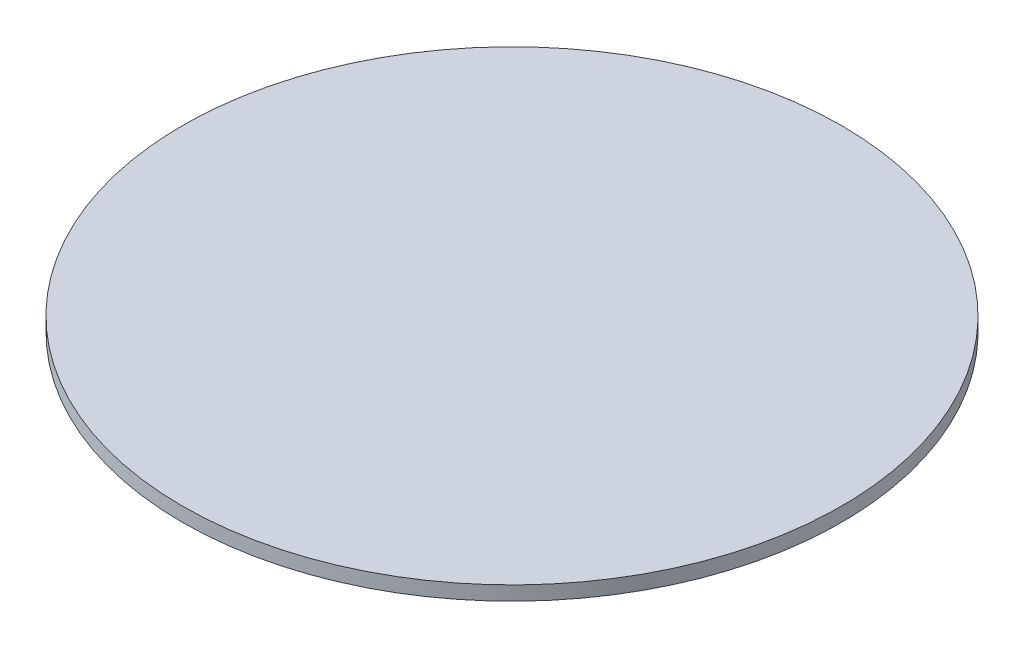
ISO-10303-21;
HEADER;
FILE_DESCRIPTION(('STEP AP214'),'2;1');
FILE_NAME('part.step','',(''),(''),'','','');
FILE_SCHEMA(('AUTOMOTIVE_DESIGN { 1 0 10303 214 1 1 1 1 }'));
ENDSEC;
DATA;
#1=APPLICATION_CONTEXT('core data for automotive mechanical design processes');
#2=APPLICATION_PROTOCOL_DEFINITION('international standard','automotive_design',2000,#1);
#3=PRODUCT_CONTEXT('',#1,'mechanical');
#4=PRODUCT('Part','Part','',(#3));
#5=PRODUCT_RELATED_PRODUCT_CATEGORY('part','',(#4));
#6=PRODUCT_DEFINITION_FORMATION('','',#4);
#7=PRODUCT_DEFINITION_CONTEXT('part definition',#1,'design');
#8=PRODUCT_DEFINITION('design','',#6,#7);
#9=PRODUCT_DEFINITION_SHAPE('','',#8);
#10=(LENGTH_UNIT() NAMED_UNIT(*) SI_UNIT(.MILLI.,.METRE.));
#11=(NAMED_UNIT(*) PLANE_ANGLE_UNIT() SI_UNIT($,.RADIAN.));
#12=(NAMED_UNIT(*) SI_UNIT($,.STERADIAN.) SOLID_ANGLE_UNIT());
#13=UNCERTAINTY_MEASURE_WITH_UNIT(LENGTH_MEASURE(1.E-05),#10,'distance_accuracy_value','');
#14=(GEOMETRIC_REPRESENTATION_CONTEXT(3) GLOBAL_UNCERTAINTY_ASSIGNED_CONTEXT((#13)) GLOBAL_UNIT_ASSIGNED_CONTEXT((#10,
#11,#12)) REPRESENTATION_CONTEXT('',''));
#15=CARTESIAN_POINT('',(0.,0.,0.));
#16=DIRECTION('',(0.,0.,1.));
#17=DIRECTION('',(1.,0.,0.));
#18=AXIS2_PLACEMENT_3D('',#15,#16,#17);
#19=CARTESIAN_POINT('',(0.,3.,0.));
#20=DIRECTION('',(0.,-1.,0.));
#21=DIRECTION('',(0.,0.,-1.));
#22=AXIS2_PLACEMENT_3D('',#19,#20,#21);
#23=CYLINDRICAL_SURFACE('',#22,70.);
#24=CARTESIAN_POINT('',(0.,3.,0.));
#25=DIRECTION('',(0.,1.,0.));
#26=DIRECTION('',(0.,0.,1.));
#27=AXIS2_PLACEMENT_3D('',#24,#25,#26);
#28=CIRCLE('',#27,70.);
#29=CARTESIAN_POINT('',(0.,3.,70.));
#30=VERTEX_POINT('',#29);
#31=EDGE_CURVE('E10',#30,#30,#28,.T.);
#32=ORIENTED_EDGE('',*,*,#31,.F.);
#33=EDGE_LOOP('',(#32));
#34=FACE_BOUND('',#33,.T.);
#35=CARTESIAN_POINT('',(0.,0.,0.));
#36=DIRECTION('',(0.,1.,0.));
#37=DIRECTION('',(0.,0.,1.));
#38=AXIS2_PLACEMENT_3D('',#35,#36,#37);
#39=CIRCLE('',#38,70.);
#40=CARTESIAN_POINT('',(0.,0.,70.));
#41=VERTEX_POINT('',#40);
#42=EDGE_CURVE('E33',#41,#41,#39,.T.);
#43=ORIENTED_EDGE('',*,*,#42,.T.);
#44=EDGE_LOOP('',(#43));
#45=FACE_BOUND('',#44,.T.);
#46=ADVANCED_FACE('F30',(#34,#45),#23,.T.);
#47=CARTESIAN_POINT('',(0.,3.,0.));
#48=DIRECTION('',(0.,1.,0.));
#49=DIRECTION('',(0.,0.,1.));
#50=AXIS2_PLACEMENT_3D('',#47,#48,#49);
#51=PLANE('',#50);
#52=ORIENTED_EDGE('',*,*,#31,.T.);
#53=EDGE_LOOP('',(#52));
#54=FACE_BOUND('',#53,.T.);
#55=ADVANCED_FACE('F45',(#54),#51,.T.);
#56=CARTESIAN_POINT('',(0.,0.,0.));
#57=DIRECTION('',(0.,1.,0.));
#58=DIRECTION('',(0.,0.,1.));
#59=AXIS2_PLACEMENT_3D('',#56,#57,#58);
#60=PLANE('',#59);
#61=ORIENTED_EDGE('',*,*,#42,.F.);
#62=EDGE_LOOP('',(#61));
#63=FACE_BOUND('',#62,.T.);
#64=ADVANCED_FACE('F43',(#63),#60,.F.);
#65=CLOSED_SHELL('',(#46,#55,#64));
#66=MANIFOLD_SOLID_BREP('B2',#65);
#67=ADVANCED_BREP_SHAPE_REPRESENTATION('',(#18,#66),#14);
#68=SHAPE_DEFINITION_REPRESENTATION(#9,#67);
ENDSEC;
END-ISO-10303-21;
